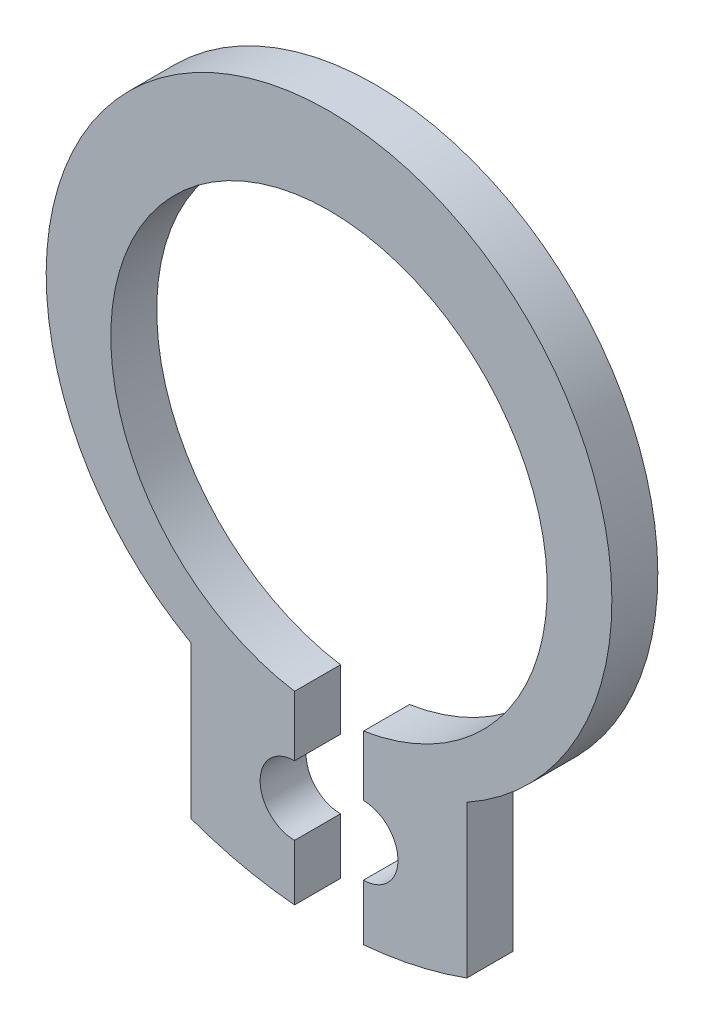
ISO-10303-21;
HEADER;
FILE_DESCRIPTION(('STEP AP214'),'2;1');
FILE_NAME('part.step','',(''),(''),'','','');
FILE_SCHEMA(('AUTOMOTIVE_DESIGN { 1 0 10303 214 1 1 1 1 }'));
ENDSEC;
DATA;
#1=APPLICATION_CONTEXT('core data for automotive mechanical design processes');
#2=APPLICATION_PROTOCOL_DEFINITION('international standard','automotive_design',2000,#1);
#3=PRODUCT_CONTEXT('',#1,'mechanical');
#4=PRODUCT('Part','Part','',(#3));
#5=PRODUCT_RELATED_PRODUCT_CATEGORY('part','',(#4));
#6=PRODUCT_DEFINITION_FORMATION('','',#4);
#7=PRODUCT_DEFINITION_CONTEXT('part definition',#1,'design');
#8=PRODUCT_DEFINITION('design','',#6,#7);
#9=PRODUCT_DEFINITION_SHAPE('','',#8);
#10=(LENGTH_UNIT() NAMED_UNIT(*) SI_UNIT(.MILLI.,.METRE.));
#11=(NAMED_UNIT(*) PLANE_ANGLE_UNIT() SI_UNIT($,.RADIAN.));
#12=(NAMED_UNIT(*) SI_UNIT($,.STERADIAN.) SOLID_ANGLE_UNIT());
#13=UNCERTAINTY_MEASURE_WITH_UNIT(LENGTH_MEASURE(1.E-05),#10,'distance_accuracy_value','');
#14=(GEOMETRIC_REPRESENTATION_CONTEXT(3) GLOBAL_UNCERTAINTY_ASSIGNED_CONTEXT((#13)) GLOBAL_UNIT_ASSIGNED_CONTEXT((#10,
#11,#12)) REPRESENTATION_CONTEXT('',''));
#15=CARTESIAN_POINT('',(0.,0.,0.));
#16=DIRECTION('',(0.,0.,1.));
#17=DIRECTION('',(1.,0.,0.));
#18=AXIS2_PLACEMENT_3D('',#15,#16,#17);
#19=CARTESIAN_POINT('',(0.6,-5.4,0.4));
#20=DIRECTION('',(0.,0.,-1.));
#21=DIRECTION('',(1.,0.,0.));
#22=AXIS2_PLACEMENT_3D('',#19,#20,#21);
#23=CYLINDRICAL_SURFACE('',#22,0.6);
#24=CARTESIAN_POINT('',(0.6,-5.4,0.));
#25=DIRECTION('',(0.,0.,1.));
#26=DIRECTION('',(1.,0.,0.));
#27=AXIS2_PLACEMENT_3D('',#24,#25,#26);
#28=CIRCLE('',#27,0.6);
#29=CARTESIAN_POINT('',(0.6,-6.,0.));
#30=VERTEX_POINT('',#29);
#31=CARTESIAN_POINT('',(0.6,-4.8,0.));
#32=VERTEX_POINT('',#31);
#33=EDGE_CURVE('E35',#30,#32,#28,.T.);
#34=ORIENTED_EDGE('',*,*,#33,.F.);
#35=DIRECTION('',(0.,0.,-1.));
#36=VECTOR('',#35,1.);
#37=CARTESIAN_POINT('',(0.6,-6.,0.4));
#38=LINE('',#37,#36);
#39=CARTESIAN_POINT('',(0.6,-6.,0.8));
#40=VERTEX_POINT('',#39);
#41=EDGE_CURVE('E153',#40,#30,#38,.T.);
#42=ORIENTED_EDGE('',*,*,#41,.F.);
#43=CARTESIAN_POINT('',(0.6,-5.4,0.8));
#44=DIRECTION('',(0.,0.,-1.));
#45=DIRECTION('',(1.,0.,0.));
#46=AXIS2_PLACEMENT_3D('',#43,#44,#45);
#47=CIRCLE('',#46,0.6);
#48=CARTESIAN_POINT('',(0.6,-4.8,0.8));
#49=VERTEX_POINT('',#48);
#50=EDGE_CURVE('E11',#49,#40,#47,.T.);
#51=ORIENTED_EDGE('',*,*,#50,.F.);
#52=DIRECTION('',(0.,0.,1.));
#53=VECTOR('',#52,1.);
#54=CARTESIAN_POINT('',(0.6,-4.8,0.4));
#55=LINE('',#54,#53);
#56=EDGE_CURVE('E173',#32,#49,#55,.T.);
#57=ORIENTED_EDGE('',*,*,#56,.F.);
#58=EDGE_LOOP('',(#34,#42,#51,#57));
#59=FACE_BOUND('',#58,.T.);
#60=ADVANCED_FACE('F16',(#59),#23,.F.);
#61=CARTESIAN_POINT('',(0.,-1.12683225826452,0.8));
#62=DIRECTION('',(0.,0.,1.));
#63=DIRECTION('',(1.,0.,0.));
#64=AXIS2_PLACEMENT_3D('',#61,#62,#63);
#65=PLANE('',#64);
#66=ORIENTED_EDGE('',*,*,#50,.T.);
#67=DIRECTION('',(0.,-1.,0.));
#68=VECTOR('',#67,1.);
#69=CARTESIAN_POINT('',(0.6,-2.95091612913226,0.8));
#70=LINE('',#69,#68);
#71=CARTESIAN_POINT('',(0.6,-6.97423830966508,0.8));
#72=VERTEX_POINT('',#71);
#73=EDGE_CURVE('E26',#40,#72,#70,.T.);
#74=ORIENTED_EDGE('',*,*,#73,.T.);
#75=CARTESIAN_POINT('',(0.,0.,0.8));
#76=DIRECTION('',(0.,0.,-1.));
#77=DIRECTION('',(1.,0.,0.));
#78=AXIS2_PLACEMENT_3D('',#75,#76,#77);
#79=CIRCLE('',#78,7.);
#80=CARTESIAN_POINT('',(2.4,-6.57571288910944,0.8));
#81=VERTEX_POINT('',#80);
#82=EDGE_CURVE('E148',#81,#72,#79,.T.);
#83=ORIENTED_EDGE('',*,*,#82,.F.);
#84=DIRECTION('',(0.,-1.,0.));
#85=VECTOR('',#84,1.);
#86=CARTESIAN_POINT('',(2.4,-6.57571288910944,0.8));
#87=LINE('',#86,#85);
#88=CARTESIAN_POINT('',(2.4,-3.92565402002997,0.8));
#89=VERTEX_POINT('',#88);
#90=EDGE_CURVE('E151',#89,#81,#87,.T.);
#91=ORIENTED_EDGE('',*,*,#90,.F.);
#92=CARTESIAN_POINT('',(0.,0.375,0.8));
#93=DIRECTION('',(0.,0.,-1.));
#94=DIRECTION('',(1.,0.,0.));
#95=AXIS2_PLACEMENT_3D('',#92,#93,#94);
#96=CIRCLE('',#95,4.925);
#97=CARTESIAN_POINT('',(-2.4,-3.92565402002997,0.8));
#98=VERTEX_POINT('',#97);
#99=EDGE_CURVE('E147',#98,#89,#96,.T.);
#100=ORIENTED_EDGE('',*,*,#99,.F.);
#101=DIRECTION('',(0.,1.,0.));
#102=VECTOR('',#101,1.);
#103=CARTESIAN_POINT('',(-2.4,-6.57571288910944,0.8));
#104=LINE('',#103,#102);
#105=CARTESIAN_POINT('',(-2.4,-6.57571288910944,0.8));
#106=VERTEX_POINT('',#105);
#107=EDGE_CURVE('E146',#106,#98,#104,.T.);
#108=ORIENTED_EDGE('',*,*,#107,.F.);
#109=CARTESIAN_POINT('',(0.,0.,0.8));
#110=DIRECTION('',(0.,0.,-1.));
#111=DIRECTION('',(1.,0.,0.));
#112=AXIS2_PLACEMENT_3D('',#109,#110,#111);
#113=CIRCLE('',#112,7.);
#114=CARTESIAN_POINT('',(-0.6,-6.97423830966508,0.8));
#115=VERTEX_POINT('',#114);
#116=EDGE_CURVE('E172',#115,#106,#113,.T.);
#117=ORIENTED_EDGE('',*,*,#116,.F.);
#118=DIRECTION('',(0.,1.,0.));
#119=VECTOR('',#118,1.);
#120=CARTESIAN_POINT('',(-0.6,-2.95091612913226,0.8));
#121=LINE('',#120,#119);
#122=CARTESIAN_POINT('',(-0.6,-6.,0.8));
#123=VERTEX_POINT('',#122);
#124=EDGE_CURVE('E179',#115,#123,#121,.T.);
#125=ORIENTED_EDGE('',*,*,#124,.T.);
#126=CARTESIAN_POINT('',(-0.6,-5.4,0.8));
#127=DIRECTION('',(0.,0.,-1.));
#128=DIRECTION('',(1.,0.,0.));
#129=AXIS2_PLACEMENT_3D('',#126,#127,#128);
#130=CIRCLE('',#129,0.6);
#131=CARTESIAN_POINT('',(-0.6,-4.8,0.8));
#132=VERTEX_POINT('',#131);
#133=EDGE_CURVE('E113',#123,#132,#130,.T.);
#134=ORIENTED_EDGE('',*,*,#133,.T.);
#135=DIRECTION('',(0.,1.,0.));
#136=VECTOR('',#135,1.);
#137=CARTESIAN_POINT('',(-0.6,-2.95091612913226,0.8));
#138=LINE('',#137,#136);
#139=CARTESIAN_POINT('',(-0.6,-3.75233260785874,0.8));
#140=VERTEX_POINT('',#139);
#141=EDGE_CURVE('E155',#132,#140,#138,.T.);
#142=ORIENTED_EDGE('',*,*,#141,.T.);
#143=CARTESIAN_POINT('',(0.,0.,0.8));
#144=DIRECTION('',(0.,0.,-1.));
#145=DIRECTION('',(1.,0.,0.));
#146=AXIS2_PLACEMENT_3D('',#143,#144,#145);
#147=CIRCLE('',#146,3.8);
#148=CARTESIAN_POINT('',(0.6,-3.75233260785874,0.8));
#149=VERTEX_POINT('',#148);
#150=EDGE_CURVE('E157',#140,#149,#147,.T.);
#151=ORIENTED_EDGE('',*,*,#150,.T.);
#152=DIRECTION('',(0.,-1.,0.));
#153=VECTOR('',#152,1.);
#154=CARTESIAN_POINT('',(0.6,-2.95091612913226,0.8));
#155=LINE('',#154,#153);
#156=EDGE_CURVE('E191',#149,#49,#155,.T.);
#157=ORIENTED_EDGE('',*,*,#156,.T.);
#158=EDGE_LOOP('',(#66,#74,#83,#91,#100,#108,#117,#125,#134,#142,#151,#157));
#159=FACE_BOUND('',#158,.T.);
#160=ADVANCED_FACE('F214',(#159),#65,.T.);
#161=CARTESIAN_POINT('',(0.6,-4.775,0.4));
#162=DIRECTION('',(-1.,0.,0.));
#163=DIRECTION('',(0.,0.,1.));
#164=AXIS2_PLACEMENT_3D('',#161,#162,#163);
#165=PLANE('',#164);
#166=ORIENTED_EDGE('',*,*,#41,.T.);
#167=DIRECTION('',(0.,1.,0.));
#168=VECTOR('',#167,1.);
#169=CARTESIAN_POINT('',(0.6,-2.95091612913226,0.));
#170=LINE('',#169,#168);
#171=CARTESIAN_POINT('',(0.6,-6.97423830966508,0.));
#172=VERTEX_POINT('',#171);
#173=EDGE_CURVE('E118',#172,#30,#170,.T.);
#174=ORIENTED_EDGE('',*,*,#173,.F.);
#175=DIRECTION('',(0.,0.,-1.));
#176=VECTOR('',#175,1.);
#177=CARTESIAN_POINT('',(0.6,-6.97423830966508,0.4));
#178=LINE('',#177,#176);
#179=EDGE_CURVE('E99',#72,#172,#178,.T.);
#180=ORIENTED_EDGE('',*,*,#179,.F.);
#181=ORIENTED_EDGE('',*,*,#73,.F.);
#182=EDGE_LOOP('',(#166,#174,#180,#181));
#183=FACE_BOUND('',#182,.T.);
#184=ADVANCED_FACE('F243',(#183),#165,.T.);
#185=CARTESIAN_POINT('',(-0.6,-5.4,0.4));
#186=DIRECTION('',(0.,0.,-1.));
#187=DIRECTION('',(1.,0.,0.));
#188=AXIS2_PLACEMENT_3D('',#185,#186,#187);
#189=CYLINDRICAL_SURFACE('',#188,0.6);
#190=DIRECTION('',(0.,0.,1.));
#191=VECTOR('',#190,1.);
#192=CARTESIAN_POINT('',(-0.6,-6.,0.4));
#193=LINE('',#192,#191);
#194=CARTESIAN_POINT('',(-0.6,-6.,0.));
#195=VERTEX_POINT('',#194);
#196=EDGE_CURVE('E106',#195,#123,#193,.T.);
#197=ORIENTED_EDGE('',*,*,#196,.F.);
#198=CARTESIAN_POINT('',(-0.6,-5.4,0.));
#199=DIRECTION('',(0.,0.,1.));
#200=DIRECTION('',(1.,0.,0.));
#201=AXIS2_PLACEMENT_3D('',#198,#199,#200);
#202=CIRCLE('',#201,0.6);
#203=CARTESIAN_POINT('',(-0.6,-4.8,0.));
#204=VERTEX_POINT('',#203);
#205=EDGE_CURVE('E110',#204,#195,#202,.T.);
#206=ORIENTED_EDGE('',*,*,#205,.F.);
#207=DIRECTION('',(0.,0.,-1.));
#208=VECTOR('',#207,1.);
#209=CARTESIAN_POINT('',(-0.6,-4.8,0.4));
#210=LINE('',#209,#208);
#211=EDGE_CURVE('E119',#132,#204,#210,.T.);
#212=ORIENTED_EDGE('',*,*,#211,.F.);
#213=ORIENTED_EDGE('',*,*,#133,.F.);
#214=EDGE_LOOP('',(#197,#206,#212,#213));
#215=FACE_BOUND('',#214,.T.);
#216=ADVANCED_FACE('F108',(#215),#189,.F.);
#217=CARTESIAN_POINT('',(0.,-1.12683225826452,0.));
#218=DIRECTION('',(0.,0.,1.));
#219=DIRECTION('',(1.,0.,0.));
#220=AXIS2_PLACEMENT_3D('',#217,#218,#219);
#221=PLANE('',#220);
#222=ORIENTED_EDGE('',*,*,#33,.T.);
#223=DIRECTION('',(0.,1.,0.));
#224=VECTOR('',#223,1.);
#225=CARTESIAN_POINT('',(0.6,-2.95091612913226,0.));
#226=LINE('',#225,#224);
#227=CARTESIAN_POINT('',(0.6,-3.75233260785874,0.));
#228=VERTEX_POINT('',#227);
#229=EDGE_CURVE('E154',#32,#228,#226,.T.);
#230=ORIENTED_EDGE('',*,*,#229,.T.);
#231=CARTESIAN_POINT('',(0.,0.,0.));
#232=DIRECTION('',(0.,0.,1.));
#233=DIRECTION('',(1.,0.,0.));
#234=AXIS2_PLACEMENT_3D('',#231,#232,#233);
#235=CIRCLE('',#234,3.8);
#236=CARTESIAN_POINT('',(-0.6,-3.75233260785874,0.));
#237=VERTEX_POINT('',#236);
#238=EDGE_CURVE('E182',#228,#237,#235,.T.);
#239=ORIENTED_EDGE('',*,*,#238,.T.);
#240=DIRECTION('',(0.,-1.,0.));
#241=VECTOR('',#240,1.);
#242=CARTESIAN_POINT('',(-0.6,-2.95091612913226,0.));
#243=LINE('',#242,#241);
#244=EDGE_CURVE('E127',#237,#204,#243,.T.);
#245=ORIENTED_EDGE('',*,*,#244,.T.);
#246=ORIENTED_EDGE('',*,*,#205,.T.);
#247=DIRECTION('',(0.,-1.,0.));
#248=VECTOR('',#247,1.);
#249=CARTESIAN_POINT('',(-0.6,-2.95091612913226,0.));
#250=LINE('',#249,#248);
#251=CARTESIAN_POINT('',(-0.6,-6.97423830966508,0.));
#252=VERTEX_POINT('',#251);
#253=EDGE_CURVE('E124',#195,#252,#250,.T.);
#254=ORIENTED_EDGE('',*,*,#253,.T.);
#255=CARTESIAN_POINT('',(0.,0.,0.));
#256=DIRECTION('',(0.,0.,1.));
#257=DIRECTION('',(1.,0.,0.));
#258=AXIS2_PLACEMENT_3D('',#255,#256,#257);
#259=CIRCLE('',#258,7.);
#260=CARTESIAN_POINT('',(-2.4,-6.57571288910944,0.));
#261=VERTEX_POINT('',#260);
#262=EDGE_CURVE('E170',#261,#252,#259,.T.);
#263=ORIENTED_EDGE('',*,*,#262,.F.);
#264=DIRECTION('',(0.,1.,0.));
#265=VECTOR('',#264,1.);
#266=CARTESIAN_POINT('',(-2.4,-6.57571288910944,0.));
#267=LINE('',#266,#265);
#268=CARTESIAN_POINT('',(-2.4,-3.92565402002997,0.));
#269=VERTEX_POINT('',#268);
#270=EDGE_CURVE('E132',#261,#269,#267,.T.);
#271=ORIENTED_EDGE('',*,*,#270,.T.);
#272=CARTESIAN_POINT('',(0.,0.375,0.));
#273=DIRECTION('',(0.,0.,1.));
#274=DIRECTION('',(1.,0.,0.));
#275=AXIS2_PLACEMENT_3D('',#272,#273,#274);
#276=CIRCLE('',#275,4.925);
#277=CARTESIAN_POINT('',(2.4,-3.92565402002997,0.));
#278=VERTEX_POINT('',#277);
#279=EDGE_CURVE('E186',#278,#269,#276,.T.);
#280=ORIENTED_EDGE('',*,*,#279,.F.);
#281=DIRECTION('',(0.,1.,0.));
#282=VECTOR('',#281,1.);
#283=CARTESIAN_POINT('',(2.4,-6.57571288910944,0.));
#284=LINE('',#283,#282);
#285=CARTESIAN_POINT('',(2.4,-6.57571288910944,0.));
#286=VERTEX_POINT('',#285);
#287=EDGE_CURVE('E142',#286,#278,#284,.T.);
#288=ORIENTED_EDGE('',*,*,#287,.F.);
#289=CARTESIAN_POINT('',(0.,0.,0.));
#290=DIRECTION('',(0.,0.,1.));
#291=DIRECTION('',(1.,0.,0.));
#292=AXIS2_PLACEMENT_3D('',#289,#290,#291);
#293=CIRCLE('',#292,7.);
#294=EDGE_CURVE('E159',#172,#286,#293,.T.);
#295=ORIENTED_EDGE('',*,*,#294,.F.);
#296=ORIENTED_EDGE('',*,*,#173,.T.);
#297=EDGE_LOOP('',(#222,#230,#239,#245,#246,#254,#263,#271,#280,#288,#295,#296));
#298=FACE_BOUND('',#297,.T.);
#299=ADVANCED_FACE('F123',(#298),#221,.F.);
#300=CARTESIAN_POINT('',(-0.6,-4.775,0.4));
#301=DIRECTION('',(1.,0.,0.));
#302=DIRECTION('',(0.,0.,-1.));
#303=AXIS2_PLACEMENT_3D('',#300,#301,#302);
#304=PLANE('',#303);
#305=ORIENTED_EDGE('',*,*,#196,.T.);
#306=ORIENTED_EDGE('',*,*,#124,.F.);
#307=DIRECTION('',(0.,0.,1.));
#308=VECTOR('',#307,1.);
#309=CARTESIAN_POINT('',(-0.6,-6.97423830966508,0.4));
#310=LINE('',#309,#308);
#311=EDGE_CURVE('E131',#252,#115,#310,.T.);
#312=ORIENTED_EDGE('',*,*,#311,.F.);
#313=ORIENTED_EDGE('',*,*,#253,.F.);
#314=EDGE_LOOP('',(#305,#306,#312,#313));
#315=FACE_BOUND('',#314,.T.);
#316=ADVANCED_FACE('F129',(#315),#304,.T.);
#317=CARTESIAN_POINT('',(-0.6,-4.775,0.4));
#318=DIRECTION('',(1.,0.,0.));
#319=DIRECTION('',(0.,0.,-1.));
#320=AXIS2_PLACEMENT_3D('',#317,#318,#319);
#321=PLANE('',#320);
#322=ORIENTED_EDGE('',*,*,#211,.T.);
#323=ORIENTED_EDGE('',*,*,#244,.F.);
#324=DIRECTION('',(0.,0.,-1.));
#325=VECTOR('',#324,1.);
#326=CARTESIAN_POINT('',(-0.6,-3.75233260785874,0.4));
#327=LINE('',#326,#325);
#328=EDGE_CURVE('E20',#140,#237,#327,.T.);
#329=ORIENTED_EDGE('',*,*,#328,.F.);
#330=ORIENTED_EDGE('',*,*,#141,.F.);
#331=EDGE_LOOP('',(#322,#323,#329,#330));
#332=FACE_BOUND('',#331,.T.);
#333=ADVANCED_FACE('F212',(#332),#321,.T.);
#334=CARTESIAN_POINT('',(0.6,-4.775,0.4));
#335=DIRECTION('',(-1.,0.,0.));
#336=DIRECTION('',(0.,0.,1.));
#337=AXIS2_PLACEMENT_3D('',#334,#335,#336);
#338=PLANE('',#337);
#339=ORIENTED_EDGE('',*,*,#56,.T.);
#340=ORIENTED_EDGE('',*,*,#156,.F.);
#341=DIRECTION('',(0.,0.,1.));
#342=VECTOR('',#341,1.);
#343=CARTESIAN_POINT('',(0.6,-3.75233260785874,0.4));
#344=LINE('',#343,#342);
#345=EDGE_CURVE('E163',#228,#149,#344,.T.);
#346=ORIENTED_EDGE('',*,*,#345,.F.);
#347=ORIENTED_EDGE('',*,*,#229,.F.);
#348=EDGE_LOOP('',(#339,#340,#346,#347));
#349=FACE_BOUND('',#348,.T.);
#350=ADVANCED_FACE('F246',(#349),#338,.T.);
#351=CARTESIAN_POINT('',(0.,0.,0.4));
#352=DIRECTION('',(0.,0.,-1.));
#353=DIRECTION('',(1.,0.,0.));
#354=AXIS2_PLACEMENT_3D('',#351,#352,#353);
#355=CYLINDRICAL_SURFACE('',#354,3.8);
#356=ORIENTED_EDGE('',*,*,#328,.T.);
#357=ORIENTED_EDGE('',*,*,#238,.F.);
#358=ORIENTED_EDGE('',*,*,#345,.T.);
#359=ORIENTED_EDGE('',*,*,#150,.F.);
#360=EDGE_LOOP('',(#356,#357,#358,#359));
#361=FACE_BOUND('',#360,.T.);
#362=ADVANCED_FACE('F210',(#361),#355,.F.);
#363=CARTESIAN_POINT('',(0.,0.,0.));
#364=DIRECTION('',(0.,0.,-1.));
#365=DIRECTION('',(1.,0.,0.));
#366=AXIS2_PLACEMENT_3D('',#363,#364,#365);
#367=CYLINDRICAL_SURFACE('',#366,7.);
#368=ORIENTED_EDGE('',*,*,#179,.T.);
#369=ORIENTED_EDGE('',*,*,#294,.T.);
#370=DIRECTION('',(0.,0.,1.));
#371=VECTOR('',#370,1.);
#372=CARTESIAN_POINT('',(2.4,-6.57571288910944,0.));
#373=LINE('',#372,#371);
#374=EDGE_CURVE('E150',#286,#81,#373,.T.);
#375=ORIENTED_EDGE('',*,*,#374,.T.);
#376=ORIENTED_EDGE('',*,*,#82,.T.);
#377=EDGE_LOOP('',(#368,#369,#375,#376));
#378=FACE_BOUND('',#377,.T.);
#379=ADVANCED_FACE('F18',(#378),#367,.T.);
#380=CARTESIAN_POINT('',(2.4,-5.25068345456971,0.));
#381=DIRECTION('',(1.,0.,0.));
#382=DIRECTION('',(0.,1.,0.));
#383=AXIS2_PLACEMENT_3D('',#380,#381,#382);
#384=PLANE('',#383);
#385=ORIENTED_EDGE('',*,*,#90,.T.);
#386=ORIENTED_EDGE('',*,*,#374,.F.);
#387=ORIENTED_EDGE('',*,*,#287,.T.);
#388=DIRECTION('',(0.,0.,1.));
#389=VECTOR('',#388,1.);
#390=CARTESIAN_POINT('',(2.4,-3.92565402002997,0.));
#391=LINE('',#390,#389);
#392=EDGE_CURVE('E139',#278,#89,#391,.T.);
#393=ORIENTED_EDGE('',*,*,#392,.T.);
#394=EDGE_LOOP('',(#385,#386,#387,#393));
#395=FACE_BOUND('',#394,.T.);
#396=ADVANCED_FACE('F227',(#395),#384,.T.);
#397=CARTESIAN_POINT('',(0.,0.,0.));
#398=DIRECTION('',(0.,0.,-1.));
#399=DIRECTION('',(1.,0.,0.));
#400=AXIS2_PLACEMENT_3D('',#397,#398,#399);
#401=CYLINDRICAL_SURFACE('',#400,7.);
#402=ORIENTED_EDGE('',*,*,#311,.T.);
#403=ORIENTED_EDGE('',*,*,#116,.T.);
#404=DIRECTION('',(0.,0.,1.));
#405=VECTOR('',#404,1.);
#406=CARTESIAN_POINT('',(-2.4,-6.57571288910944,0.));
#407=LINE('',#406,#405);
#408=EDGE_CURVE('E143',#261,#106,#407,.T.);
#409=ORIENTED_EDGE('',*,*,#408,.F.);
#410=ORIENTED_EDGE('',*,*,#262,.T.);
#411=EDGE_LOOP('',(#402,#403,#409,#410));
#412=FACE_BOUND('',#411,.T.);
#413=ADVANCED_FACE('F225',(#412),#401,.T.);
#414=CARTESIAN_POINT('',(-2.4,-5.25068345456971,0.));
#415=DIRECTION('',(-1.,0.,0.));
#416=DIRECTION('',(0.,-1.,0.));
#417=AXIS2_PLACEMENT_3D('',#414,#415,#416);
#418=PLANE('',#417);
#419=ORIENTED_EDGE('',*,*,#107,.T.);
#420=DIRECTION('',(0.,0.,1.));
#421=VECTOR('',#420,1.);
#422=CARTESIAN_POINT('',(-2.4,-3.92565402002997,0.));
#423=LINE('',#422,#421);
#424=EDGE_CURVE('E183',#269,#98,#423,.T.);
#425=ORIENTED_EDGE('',*,*,#424,.F.);
#426=ORIENTED_EDGE('',*,*,#270,.F.);
#427=ORIENTED_EDGE('',*,*,#408,.T.);
#428=EDGE_LOOP('',(#419,#425,#426,#427));
#429=FACE_BOUND('',#428,.T.);
#430=ADVANCED_FACE('F218',(#429),#418,.T.);
#431=CARTESIAN_POINT('',(0.,0.375,0.));
#432=DIRECTION('',(0.,0.,-1.));
#433=DIRECTION('',(1.,0.,0.));
#434=AXIS2_PLACEMENT_3D('',#431,#432,#433);
#435=CYLINDRICAL_SURFACE('',#434,4.925);
#436=ORIENTED_EDGE('',*,*,#99,.T.);
#437=ORIENTED_EDGE('',*,*,#392,.F.);
#438=ORIENTED_EDGE('',*,*,#279,.T.);
#439=ORIENTED_EDGE('',*,*,#424,.T.);
#440=EDGE_LOOP('',(#436,#437,#438,#439));
#441=FACE_BOUND('',#440,.T.);
#442=ADVANCED_FACE('F221',(#441),#435,.T.);
#443=CLOSED_SHELL('',(#60,#160,#184,#216,#299,#316,#333,#350,#362,#379,#396,#413,#430,#442));
#444=MANIFOLD_SOLID_BREP('B1',#443);
#445=ADVANCED_BREP_SHAPE_REPRESENTATION('',(#18,#444),#14);
#446=SHAPE_DEFINITION_REPRESENTATION(#9,#445);
ENDSEC;
END-ISO-10303-21;
